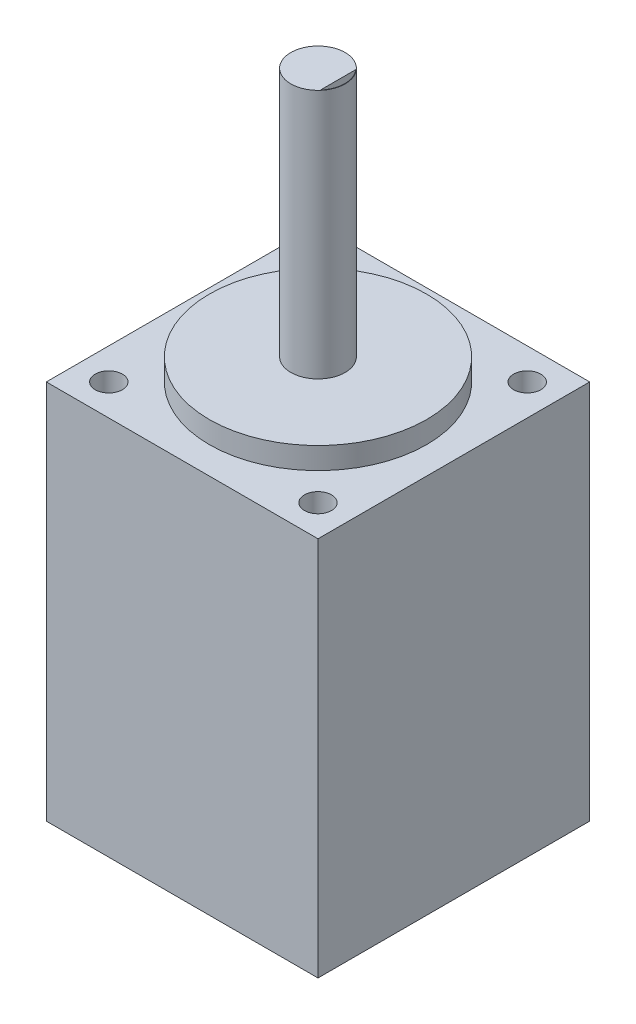
ISO-10303-21;
HEADER;
FILE_DESCRIPTION(('STEP AP214'),'2;1');
FILE_NAME('part.step','',(''),(''),'','','');
FILE_SCHEMA(('AUTOMOTIVE_DESIGN { 1 0 10303 214 1 1 1 1 }'));
ENDSEC;
DATA;
#1=APPLICATION_CONTEXT('core data for automotive mechanical design processes');
#2=APPLICATION_PROTOCOL_DEFINITION('international standard','automotive_design',2000,#1);
#3=PRODUCT_CONTEXT('',#1,'mechanical');
#4=PRODUCT('Part','Part','',(#3));
#5=PRODUCT_RELATED_PRODUCT_CATEGORY('part','',(#4));
#6=PRODUCT_DEFINITION_FORMATION('','',#4);
#7=PRODUCT_DEFINITION_CONTEXT('part definition',#1,'design');
#8=PRODUCT_DEFINITION('design','',#6,#7);
#9=PRODUCT_DEFINITION_SHAPE('','',#8);
#10=(LENGTH_UNIT() NAMED_UNIT(*) SI_UNIT(.MILLI.,.METRE.));
#11=(NAMED_UNIT(*) PLANE_ANGLE_UNIT() SI_UNIT($,.RADIAN.));
#12=(NAMED_UNIT(*) SI_UNIT($,.STERADIAN.) SOLID_ANGLE_UNIT());
#13=UNCERTAINTY_MEASURE_WITH_UNIT(LENGTH_MEASURE(1.E-05),#10,'distance_accuracy_value','');
#14=(GEOMETRIC_REPRESENTATION_CONTEXT(3) GLOBAL_UNCERTAINTY_ASSIGNED_CONTEXT((#13)) GLOBAL_UNIT_ASSIGNED_CONTEXT((#10,
#11,#12)) REPRESENTATION_CONTEXT('',''));
#15=CARTESIAN_POINT('',(0.,0.,0.));
#16=DIRECTION('',(0.,0.,1.));
#17=DIRECTION('',(1.,0.,0.));
#18=AXIS2_PLACEMENT_3D('',#15,#16,#17);
#19=CARTESIAN_POINT('',(0.,28.,0.));
#20=DIRECTION('',(0.,-1.,0.));
#21=DIRECTION('',(0.,0.,-1.));
#22=AXIS2_PLACEMENT_3D('',#19,#20,#21);
#23=PLANE('',#22);
#24=CARTESIAN_POINT('',(10.,28.,-10.));
#25=DIRECTION('',(0.,1.,0.));
#26=DIRECTION('',(0.,0.,1.));
#27=AXIS2_PLACEMENT_3D('',#24,#25,#26);
#28=CIRCLE('',#27,8.);
#29=CARTESIAN_POINT('',(10.,28.,-1.99999999999999));
#30=VERTEX_POINT('',#29);
#31=EDGE_CURVE('E52',#30,#30,#28,.T.);
#32=ORIENTED_EDGE('',*,*,#31,.F.);
#33=EDGE_LOOP('',(#32));
#34=FACE_BOUND('',#33,.T.);
#35=DIRECTION('',(0.,0.,1.));
#36=VECTOR('',#35,1.);
#37=CARTESIAN_POINT('',(0.,28.,0.));
#38=LINE('',#37,#36);
#39=CARTESIAN_POINT('',(0.,28.,-20.));
#40=VERTEX_POINT('',#39);
#41=CARTESIAN_POINT('',(0.,28.,0.));
#42=VERTEX_POINT('',#41);
#43=EDGE_CURVE('E178',#40,#42,#38,.T.);
#44=ORIENTED_EDGE('',*,*,#43,.T.);
#45=DIRECTION('',(1.,0.,0.));
#46=VECTOR('',#45,1.);
#47=CARTESIAN_POINT('',(0.,28.,0.));
#48=LINE('',#47,#46);
#49=CARTESIAN_POINT('',(20.,28.,0.));
#50=VERTEX_POINT('',#49);
#51=EDGE_CURVE('E98',#42,#50,#48,.T.);
#52=ORIENTED_EDGE('',*,*,#51,.T.);
#53=DIRECTION('',(0.,0.,-1.));
#54=VECTOR('',#53,1.);
#55=CARTESIAN_POINT('',(20.,28.,0.));
#56=LINE('',#55,#54);
#57=CARTESIAN_POINT('',(20.,28.,-20.));
#58=VERTEX_POINT('',#57);
#59=EDGE_CURVE('E183',#50,#58,#56,.T.);
#60=ORIENTED_EDGE('',*,*,#59,.T.);
#61=DIRECTION('',(-1.,0.,0.));
#62=VECTOR('',#61,1.);
#63=CARTESIAN_POINT('',(0.,28.,-20.));
#64=LINE('',#63,#62);
#65=EDGE_CURVE('E69',#58,#40,#64,.T.);
#66=ORIENTED_EDGE('',*,*,#65,.T.);
#67=EDGE_LOOP('',(#44,#52,#60,#66));
#68=FACE_BOUND('',#67,.T.);
#69=CARTESIAN_POINT('',(2.3,28.,-17.7));
#70=DIRECTION('',(0.,1.,0.));
#71=DIRECTION('',(0.,0.,1.));
#72=AXIS2_PLACEMENT_3D('',#69,#70,#71);
#73=CIRCLE('',#72,1.);
#74=CARTESIAN_POINT('',(2.3,28.,-16.7));
#75=VERTEX_POINT('',#74);
#76=EDGE_CURVE('E170',#75,#75,#73,.T.);
#77=ORIENTED_EDGE('',*,*,#76,.F.);
#78=EDGE_LOOP('',(#77));
#79=FACE_BOUND('',#78,.T.);
#80=CARTESIAN_POINT('',(17.7,28.,-2.3));
#81=DIRECTION('',(0.,1.,0.));
#82=DIRECTION('',(0.,0.,1.));
#83=AXIS2_PLACEMENT_3D('',#80,#81,#82);
#84=CIRCLE('',#83,1.);
#85=CARTESIAN_POINT('',(17.7,28.,-1.3));
#86=VERTEX_POINT('',#85);
#87=EDGE_CURVE('E162',#86,#86,#84,.T.);
#88=ORIENTED_EDGE('',*,*,#87,.F.);
#89=EDGE_LOOP('',(#88));
#90=FACE_BOUND('',#89,.T.);
#91=CARTESIAN_POINT('',(17.7,28.,-17.7));
#92=DIRECTION('',(0.,1.,0.));
#93=DIRECTION('',(0.,0.,1.));
#94=AXIS2_PLACEMENT_3D('',#91,#92,#93);
#95=CIRCLE('',#94,1.);
#96=CARTESIAN_POINT('',(17.7,28.,-16.7));
#97=VERTEX_POINT('',#96);
#98=EDGE_CURVE('E154',#97,#97,#95,.T.);
#99=ORIENTED_EDGE('',*,*,#98,.F.);
#100=EDGE_LOOP('',(#99));
#101=FACE_BOUND('',#100,.T.);
#102=CARTESIAN_POINT('',(2.3,28.,-2.3));
#103=DIRECTION('',(0.,1.,0.));
#104=DIRECTION('',(0.,0.,1.));
#105=AXIS2_PLACEMENT_3D('',#102,#103,#104);
#106=CIRCLE('',#105,1.);
#107=CARTESIAN_POINT('',(2.3,28.,-1.3));
#108=VERTEX_POINT('',#107);
#109=EDGE_CURVE('E146',#108,#108,#106,.T.);
#110=ORIENTED_EDGE('',*,*,#109,.F.);
#111=EDGE_LOOP('',(#110));
#112=FACE_BOUND('',#111,.T.);
#113=ADVANCED_FACE('F42',(#34,#68,#79,#90,#101,#112),#23,.F.);
#114=CARTESIAN_POINT('',(0.,0.,0.));
#115=DIRECTION('',(0.,-1.,0.));
#116=DIRECTION('',(0.,0.,-1.));
#117=AXIS2_PLACEMENT_3D('',#114,#115,#116);
#118=PLANE('',#117);
#119=CARTESIAN_POINT('',(17.7,0.,-17.7));
#120=DIRECTION('',(0.,1.,0.));
#121=DIRECTION('',(0.,0.,1.));
#122=AXIS2_PLACEMENT_3D('',#119,#120,#121);
#123=CIRCLE('',#122,1.);
#124=CARTESIAN_POINT('',(17.7,0.,-16.7));
#125=VERTEX_POINT('',#124);
#126=EDGE_CURVE('E150',#125,#125,#123,.T.);
#127=ORIENTED_EDGE('',*,*,#126,.T.);
#128=EDGE_LOOP('',(#127));
#129=FACE_BOUND('',#128,.T.);
#130=CARTESIAN_POINT('',(2.3,0.,-17.7));
#131=DIRECTION('',(0.,1.,0.));
#132=DIRECTION('',(0.,0.,1.));
#133=AXIS2_PLACEMENT_3D('',#130,#131,#132);
#134=CIRCLE('',#133,1.);
#135=CARTESIAN_POINT('',(2.3,0.,-16.7));
#136=VERTEX_POINT('',#135);
#137=EDGE_CURVE('E166',#136,#136,#134,.T.);
#138=ORIENTED_EDGE('',*,*,#137,.T.);
#139=EDGE_LOOP('',(#138));
#140=FACE_BOUND('',#139,.T.);
#141=DIRECTION('',(0.,0.,1.));
#142=VECTOR('',#141,1.);
#143=CARTESIAN_POINT('',(0.,0.,0.));
#144=LINE('',#143,#142);
#145=CARTESIAN_POINT('',(0.,0.,-20.));
#146=VERTEX_POINT('',#145);
#147=CARTESIAN_POINT('',(0.,0.,0.));
#148=VERTEX_POINT('',#147);
#149=EDGE_CURVE('E174',#146,#148,#144,.T.);
#150=ORIENTED_EDGE('',*,*,#149,.F.);
#151=DIRECTION('',(-1.,0.,0.));
#152=VECTOR('',#151,1.);
#153=CARTESIAN_POINT('',(0.,0.,-20.));
#154=LINE('',#153,#152);
#155=CARTESIAN_POINT('',(20.,0.,-20.));
#156=VERTEX_POINT('',#155);
#157=EDGE_CURVE('E90',#156,#146,#154,.T.);
#158=ORIENTED_EDGE('',*,*,#157,.F.);
#159=DIRECTION('',(0.,0.,-1.));
#160=VECTOR('',#159,1.);
#161=CARTESIAN_POINT('',(20.,0.,0.));
#162=LINE('',#161,#160);
#163=CARTESIAN_POINT('',(20.,0.,0.));
#164=VERTEX_POINT('',#163);
#165=EDGE_CURVE('E195',#164,#156,#162,.T.);
#166=ORIENTED_EDGE('',*,*,#165,.F.);
#167=DIRECTION('',(1.,0.,0.));
#168=VECTOR('',#167,1.);
#169=CARTESIAN_POINT('',(0.,0.,0.));
#170=LINE('',#169,#168);
#171=EDGE_CURVE('E192',#148,#164,#170,.T.);
#172=ORIENTED_EDGE('',*,*,#171,.F.);
#173=EDGE_LOOP('',(#150,#158,#166,#172));
#174=FACE_BOUND('',#173,.T.);
#175=CARTESIAN_POINT('',(17.7,0.,-2.3));
#176=DIRECTION('',(0.,1.,0.));
#177=DIRECTION('',(0.,0.,1.));
#178=AXIS2_PLACEMENT_3D('',#175,#176,#177);
#179=CIRCLE('',#178,1.);
#180=CARTESIAN_POINT('',(17.7,0.,-1.3));
#181=VERTEX_POINT('',#180);
#182=EDGE_CURVE('E158',#181,#181,#179,.T.);
#183=ORIENTED_EDGE('',*,*,#182,.T.);
#184=EDGE_LOOP('',(#183));
#185=FACE_BOUND('',#184,.T.);
#186=CARTESIAN_POINT('',(2.3,0.,-2.3));
#187=DIRECTION('',(0.,1.,0.));
#188=DIRECTION('',(0.,0.,1.));
#189=AXIS2_PLACEMENT_3D('',#186,#187,#188);
#190=CIRCLE('',#189,1.);
#191=CARTESIAN_POINT('',(2.3,0.,-1.3));
#192=VERTEX_POINT('',#191);
#193=EDGE_CURVE('E142',#192,#192,#190,.T.);
#194=ORIENTED_EDGE('',*,*,#193,.T.);
#195=EDGE_LOOP('',(#194));
#196=FACE_BOUND('',#195,.T.);
#197=ADVANCED_FACE('F217',(#129,#140,#174,#185,#196),#118,.T.);
#198=CARTESIAN_POINT('',(0.,28.,0.));
#199=DIRECTION('',(1.,0.,0.));
#200=DIRECTION('',(0.,0.,-1.));
#201=AXIS2_PLACEMENT_3D('',#198,#199,#200);
#202=PLANE('',#201);
#203=ORIENTED_EDGE('',*,*,#149,.T.);
#204=DIRECTION('',(0.,-1.,0.));
#205=VECTOR('',#204,1.);
#206=CARTESIAN_POINT('',(0.,28.,0.));
#207=LINE('',#206,#205);
#208=EDGE_CURVE('E46',#42,#148,#207,.T.);
#209=ORIENTED_EDGE('',*,*,#208,.F.);
#210=ORIENTED_EDGE('',*,*,#43,.F.);
#211=DIRECTION('',(0.,-1.,0.));
#212=VECTOR('',#211,1.);
#213=CARTESIAN_POINT('',(0.,28.,-20.));
#214=LINE('',#213,#212);
#215=EDGE_CURVE('E188',#40,#146,#214,.T.);
#216=ORIENTED_EDGE('',*,*,#215,.T.);
#217=EDGE_LOOP('',(#203,#209,#210,#216));
#218=FACE_BOUND('',#217,.T.);
#219=ADVANCED_FACE('F44',(#218),#202,.F.);
#220=CARTESIAN_POINT('',(0.,28.,0.));
#221=DIRECTION('',(0.,0.,-1.));
#222=DIRECTION('',(-1.,0.,0.));
#223=AXIS2_PLACEMENT_3D('',#220,#221,#222);
#224=PLANE('',#223);
#225=ORIENTED_EDGE('',*,*,#171,.T.);
#226=DIRECTION('',(0.,-1.,0.));
#227=VECTOR('',#226,1.);
#228=CARTESIAN_POINT('',(20.,28.,0.));
#229=LINE('',#228,#227);
#230=EDGE_CURVE('E204',#50,#164,#229,.T.);
#231=ORIENTED_EDGE('',*,*,#230,.F.);
#232=ORIENTED_EDGE('',*,*,#51,.F.);
#233=ORIENTED_EDGE('',*,*,#208,.T.);
#234=EDGE_LOOP('',(#225,#231,#232,#233));
#235=FACE_BOUND('',#234,.T.);
#236=ADVANCED_FACE('F212',(#235),#224,.F.);
#237=CARTESIAN_POINT('',(20.,28.,0.));
#238=DIRECTION('',(-1.,0.,0.));
#239=DIRECTION('',(0.,0.,1.));
#240=AXIS2_PLACEMENT_3D('',#237,#238,#239);
#241=PLANE('',#240);
#242=ORIENTED_EDGE('',*,*,#165,.T.);
#243=DIRECTION('',(0.,-1.,0.));
#244=VECTOR('',#243,1.);
#245=CARTESIAN_POINT('',(20.,28.,-20.));
#246=LINE('',#245,#244);
#247=EDGE_CURVE('E202',#58,#156,#246,.T.);
#248=ORIENTED_EDGE('',*,*,#247,.F.);
#249=ORIENTED_EDGE('',*,*,#59,.F.);
#250=ORIENTED_EDGE('',*,*,#230,.T.);
#251=EDGE_LOOP('',(#242,#248,#249,#250));
#252=FACE_BOUND('',#251,.T.);
#253=ADVANCED_FACE('F220',(#252),#241,.F.);
#254=CARTESIAN_POINT('',(0.,28.,-20.));
#255=DIRECTION('',(0.,0.,1.));
#256=DIRECTION('',(1.,0.,0.));
#257=AXIS2_PLACEMENT_3D('',#254,#255,#256);
#258=PLANE('',#257);
#259=ORIENTED_EDGE('',*,*,#157,.T.);
#260=ORIENTED_EDGE('',*,*,#215,.F.);
#261=ORIENTED_EDGE('',*,*,#65,.F.);
#262=ORIENTED_EDGE('',*,*,#247,.T.);
#263=EDGE_LOOP('',(#259,#260,#261,#262));
#264=FACE_BOUND('',#263,.T.);
#265=ADVANCED_FACE('F221',(#264),#258,.F.);
#266=CARTESIAN_POINT('',(2.3,28.,-17.7));
#267=DIRECTION('',(0.,-1.,0.));
#268=DIRECTION('',(0.,0.,-1.));
#269=AXIS2_PLACEMENT_3D('',#266,#267,#268);
#270=CYLINDRICAL_SURFACE('',#269,1.);
#271=ORIENTED_EDGE('',*,*,#76,.T.);
#272=EDGE_LOOP('',(#271));
#273=FACE_BOUND('',#272,.T.);
#274=ORIENTED_EDGE('',*,*,#137,.F.);
#275=EDGE_LOOP('',(#274));
#276=FACE_BOUND('',#275,.T.);
#277=ADVANCED_FACE('F253',(#273,#276),#270,.F.);
#278=CARTESIAN_POINT('',(17.7,28.,-2.3));
#279=DIRECTION('',(0.,-1.,0.));
#280=DIRECTION('',(0.,0.,-1.));
#281=AXIS2_PLACEMENT_3D('',#278,#279,#280);
#282=CYLINDRICAL_SURFACE('',#281,1.);
#283=ORIENTED_EDGE('',*,*,#87,.T.);
#284=EDGE_LOOP('',(#283));
#285=FACE_BOUND('',#284,.T.);
#286=ORIENTED_EDGE('',*,*,#182,.F.);
#287=EDGE_LOOP('',(#286));
#288=FACE_BOUND('',#287,.T.);
#289=ADVANCED_FACE('F274',(#285,#288),#282,.F.);
#290=CARTESIAN_POINT('',(17.7,28.,-17.7));
#291=DIRECTION('',(0.,-1.,0.));
#292=DIRECTION('',(0.,0.,-1.));
#293=AXIS2_PLACEMENT_3D('',#290,#291,#292);
#294=CYLINDRICAL_SURFACE('',#293,1.);
#295=ORIENTED_EDGE('',*,*,#98,.T.);
#296=EDGE_LOOP('',(#295));
#297=FACE_BOUND('',#296,.T.);
#298=ORIENTED_EDGE('',*,*,#126,.F.);
#299=EDGE_LOOP('',(#298));
#300=FACE_BOUND('',#299,.T.);
#301=ADVANCED_FACE('F238',(#297,#300),#294,.F.);
#302=CARTESIAN_POINT('',(2.3,28.,-2.3));
#303=DIRECTION('',(0.,-1.,0.));
#304=DIRECTION('',(0.,0.,-1.));
#305=AXIS2_PLACEMENT_3D('',#302,#303,#304);
#306=CYLINDRICAL_SURFACE('',#305,1.);
#307=ORIENTED_EDGE('',*,*,#109,.T.);
#308=EDGE_LOOP('',(#307));
#309=FACE_BOUND('',#308,.T.);
#310=ORIENTED_EDGE('',*,*,#193,.F.);
#311=EDGE_LOOP('',(#310));
#312=FACE_BOUND('',#311,.T.);
#313=ADVANCED_FACE('F234',(#309,#312),#306,.F.);
#314=CARTESIAN_POINT('',(10.,29.6,-10.));
#315=DIRECTION('',(0.,-1.,0.));
#316=DIRECTION('',(0.,0.,-1.));
#317=AXIS2_PLACEMENT_3D('',#314,#315,#316);
#318=CYLINDRICAL_SURFACE('',#317,8.);
#319=CARTESIAN_POINT('',(10.,29.6,-10.));
#320=DIRECTION('',(0.,1.,0.));
#321=DIRECTION('',(0.,0.,1.));
#322=AXIS2_PLACEMENT_3D('',#319,#320,#321);
#323=CIRCLE('',#322,8.);
#324=CARTESIAN_POINT('',(10.,29.6,-1.99999999999999));
#325=VERTEX_POINT('',#324);
#326=EDGE_CURVE('E137',#325,#325,#323,.T.);
#327=ORIENTED_EDGE('',*,*,#326,.F.);
#328=EDGE_LOOP('',(#327));
#329=FACE_BOUND('',#328,.T.);
#330=ORIENTED_EDGE('',*,*,#31,.T.);
#331=EDGE_LOOP('',(#330));
#332=FACE_BOUND('',#331,.T.);
#333=ADVANCED_FACE('F237',(#329,#332),#318,.T.);
#334=CARTESIAN_POINT('',(0.,29.6,0.));
#335=DIRECTION('',(0.,1.,0.));
#336=DIRECTION('',(0.,0.,1.));
#337=AXIS2_PLACEMENT_3D('',#334,#335,#336);
#338=PLANE('',#337);
#339=CARTESIAN_POINT('',(10.,29.6,-10.));
#340=DIRECTION('',(0.,1.,0.));
#341=DIRECTION('',(0.,0.,1.));
#342=AXIS2_PLACEMENT_3D('',#339,#340,#341);
#343=CIRCLE('',#342,2.);
#344=CARTESIAN_POINT('',(10.,29.6,-8.));
#345=VERTEX_POINT('',#344);
#346=EDGE_CURVE('E12',#345,#345,#343,.T.);
#347=ORIENTED_EDGE('',*,*,#346,.F.);
#348=EDGE_LOOP('',(#347));
#349=FACE_BOUND('',#348,.T.);
#350=ORIENTED_EDGE('',*,*,#326,.T.);
#351=EDGE_LOOP('',(#350));
#352=FACE_BOUND('',#351,.T.);
#353=ADVANCED_FACE('F300',(#349,#352),#338,.T.);
#354=CARTESIAN_POINT('',(10.,48.,-10.));
#355=DIRECTION('',(0.,-1.,0.));
#356=DIRECTION('',(0.,0.,-1.));
#357=AXIS2_PLACEMENT_3D('',#354,#355,#356);
#358=CYLINDRICAL_SURFACE('',#357,2.);
#359=CARTESIAN_POINT('',(10.,48.,-10.));
#360=DIRECTION('',(0.,1.,0.));
#361=DIRECTION('',(0.,0.,1.));
#362=AXIS2_PLACEMENT_3D('',#359,#360,#361);
#363=CIRCLE('',#362,2.);
#364=CARTESIAN_POINT('',(10.,48.,-8.));
#365=VERTEX_POINT('',#364);
#366=EDGE_CURVE('E133',#365,#365,#363,.T.);
#367=ORIENTED_EDGE('',*,*,#366,.F.);
#368=EDGE_LOOP('',(#367));
#369=FACE_BOUND('',#368,.T.);
#370=ORIENTED_EDGE('',*,*,#346,.T.);
#371=EDGE_LOOP('',(#370));
#372=FACE_BOUND('',#371,.T.);
#373=ADVANCED_FACE('F308',(#369,#372),#358,.T.);
#374=CARTESIAN_POINT('',(10.,48.,-10.));
#375=DIRECTION('',(0.,1.,0.));
#376=DIRECTION('',(0.,0.,1.));
#377=AXIS2_PLACEMENT_3D('',#374,#375,#376);
#378=PLANE('',#377);
#379=DIRECTION('',(0.,0.,1.));
#380=VECTOR('',#379,1.);
#381=CARTESIAN_POINT('',(11.4812796169812,48.,0.));
#382=LINE('',#381,#380);
#383=CARTESIAN_POINT('',(11.4812796169812,48.,-11.3041552725135));
#384=VERTEX_POINT('',#383);
#385=CARTESIAN_POINT('',(11.4812796169812,48.,-8.69584472748654));
#386=VERTEX_POINT('',#385);
#387=EDGE_CURVE('E60',#384,#386,#382,.T.);
#388=ORIENTED_EDGE('',*,*,#387,.F.);
#389=CARTESIAN_POINT('',(10.,48.,-10.));
#390=DIRECTION('',(0.,1.,0.));
#391=DIRECTION('',(0.,0.,1.));
#392=AXIS2_PLACEMENT_3D('',#389,#390,#391);
#393=CIRCLE('',#392,1.97357803962968);
#394=EDGE_CURVE('E122',#386,#384,#393,.T.);
#395=ORIENTED_EDGE('',*,*,#394,.F.);
#396=EDGE_LOOP('',(#388,#395));
#397=FACE_BOUND('',#396,.T.);
#398=ORIENTED_EDGE('',*,*,#366,.T.);
#399=EDGE_LOOP('',(#398));
#400=FACE_BOUND('',#399,.T.);
#401=ADVANCED_FACE('F316',(#397,#400),#378,.T.);
#402=CARTESIAN_POINT('',(11.4812796169812,33.,0.));
#403=DIRECTION('',(-1.,0.,0.));
#404=DIRECTION('',(0.,0.,1.));
#405=AXIS2_PLACEMENT_3D('',#402,#403,#404);
#406=PLANE('',#405);
#407=ORIENTED_EDGE('',*,*,#387,.T.);
#408=DIRECTION('',(0.,1.,0.));
#409=VECTOR('',#408,1.);
#410=CARTESIAN_POINT('',(11.4812796169812,33.,-8.69584472748654));
#411=LINE('',#410,#409);
#412=CARTESIAN_POINT('',(11.4812796169812,33.,-8.69584472748654));
#413=VERTEX_POINT('',#412);
#414=EDGE_CURVE('E106',#413,#386,#411,.T.);
#415=ORIENTED_EDGE('',*,*,#414,.F.);
#416=DIRECTION('',(0.,0.,1.));
#417=VECTOR('',#416,1.);
#418=CARTESIAN_POINT('',(11.4812796169812,33.,0.));
#419=LINE('',#418,#417);
#420=CARTESIAN_POINT('',(11.4812796169812,33.,-11.3041552725135));
#421=VERTEX_POINT('',#420);
#422=EDGE_CURVE('E109',#421,#413,#419,.T.);
#423=ORIENTED_EDGE('',*,*,#422,.F.);
#424=DIRECTION('',(0.,1.,0.));
#425=VECTOR('',#424,1.);
#426=CARTESIAN_POINT('',(11.4812796169812,33.,-11.3041552725135));
#427=LINE('',#426,#425);
#428=EDGE_CURVE('E116',#421,#384,#427,.T.);
#429=ORIENTED_EDGE('',*,*,#428,.T.);
#430=EDGE_LOOP('',(#407,#415,#423,#429));
#431=FACE_BOUND('',#430,.T.);
#432=ADVANCED_FACE('F108',(#431),#406,.F.);
#433=CARTESIAN_POINT('',(10.,33.,-10.));
#434=DIRECTION('',(0.,1.,0.));
#435=DIRECTION('',(0.,0.,1.));
#436=AXIS2_PLACEMENT_3D('',#433,#434,#435);
#437=CYLINDRICAL_SURFACE('',#436,1.97357803962968);
#438=ORIENTED_EDGE('',*,*,#394,.T.);
#439=ORIENTED_EDGE('',*,*,#428,.F.);
#440=CARTESIAN_POINT('',(10.,33.,-10.));
#441=DIRECTION('',(0.,1.,0.));
#442=DIRECTION('',(0.,0.,1.));
#443=AXIS2_PLACEMENT_3D('',#440,#441,#442);
#444=CIRCLE('',#443,1.97357803962968);
#445=EDGE_CURVE('E117',#413,#421,#444,.T.);
#446=ORIENTED_EDGE('',*,*,#445,.F.);
#447=ORIENTED_EDGE('',*,*,#414,.T.);
#448=EDGE_LOOP('',(#438,#439,#446,#447));
#449=FACE_BOUND('',#448,.T.);
#450=ADVANCED_FACE('F124',(#449),#437,.F.);
#451=CARTESIAN_POINT('',(0.,33.,0.));
#452=DIRECTION('',(0.,1.,0.));
#453=DIRECTION('',(0.,0.,1.));
#454=AXIS2_PLACEMENT_3D('',#451,#452,#453);
#455=PLANE('',#454);
#456=ORIENTED_EDGE('',*,*,#422,.T.);
#457=ORIENTED_EDGE('',*,*,#445,.T.);
#458=EDGE_LOOP('',(#456,#457));
#459=FACE_BOUND('',#458,.T.);
#460=ADVANCED_FACE('F120',(#459),#455,.T.);
#461=CLOSED_SHELL('',(#113,#197,#219,#236,#253,#265,#277,#289,#301,#313,#333,#353,#373,#401,
#432,#450,#460));
#462=MANIFOLD_SOLID_BREP('B2',#461);
#463=ADVANCED_BREP_SHAPE_REPRESENTATION('',(#18,#462),#14);
#464=SHAPE_DEFINITION_REPRESENTATION(#9,#463);
ENDSEC;
END-ISO-10303-21;
